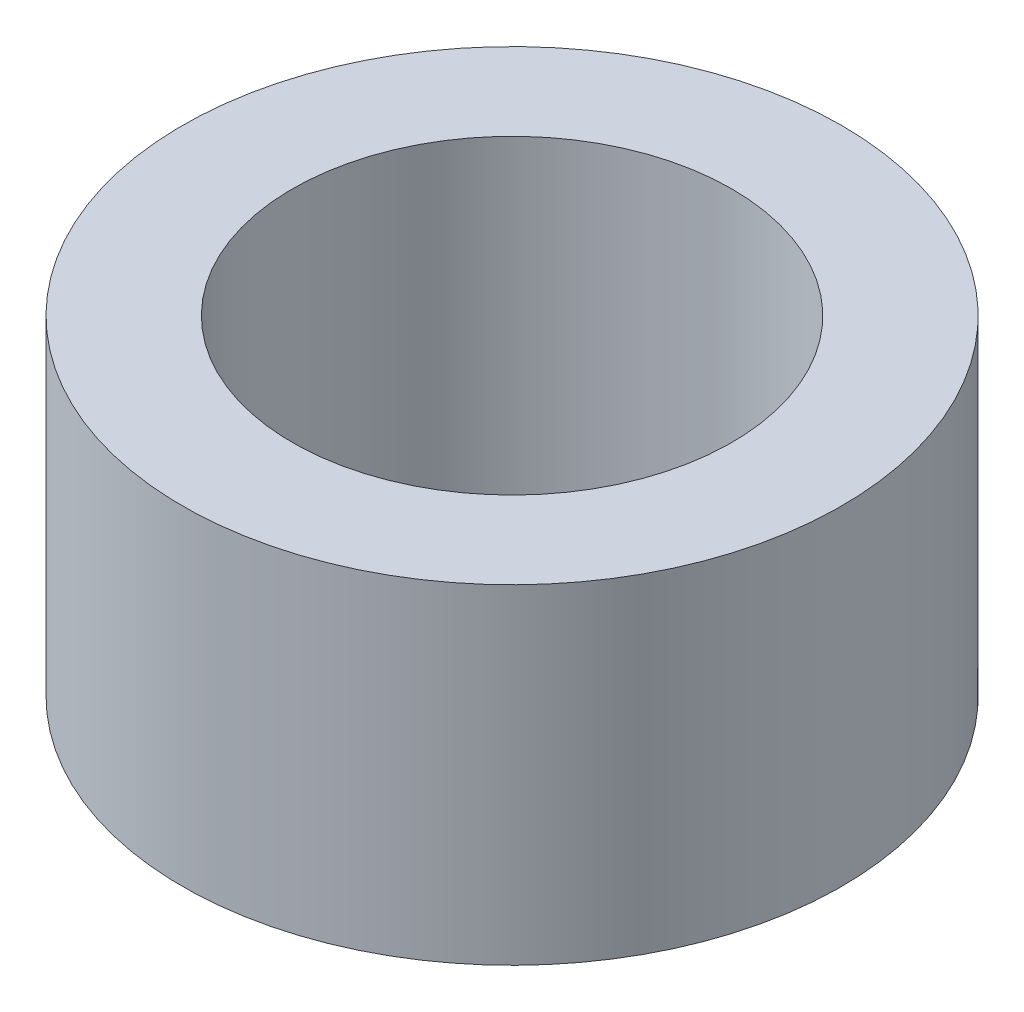
ISO-10303-21;
HEADER;
FILE_DESCRIPTION(('STEP AP214'),'2;1');
FILE_NAME('part.step','',(''),(''),'','','');
FILE_SCHEMA(('AUTOMOTIVE_DESIGN { 1 0 10303 214 1 1 1 1 }'));
ENDSEC;
DATA;
#1=APPLICATION_CONTEXT('core data for automotive mechanical design processes');
#2=APPLICATION_PROTOCOL_DEFINITION('international standard','automotive_design',2000,#1);
#3=PRODUCT_CONTEXT('',#1,'mechanical');
#4=PRODUCT('Part','Part','',(#3));
#5=PRODUCT_RELATED_PRODUCT_CATEGORY('part','',(#4));
#6=PRODUCT_DEFINITION_FORMATION('','',#4);
#7=PRODUCT_DEFINITION_CONTEXT('part definition',#1,'design');
#8=PRODUCT_DEFINITION('design','',#6,#7);
#9=PRODUCT_DEFINITION_SHAPE('','',#8);
#10=(LENGTH_UNIT() NAMED_UNIT(*) SI_UNIT(.MILLI.,.METRE.));
#11=(NAMED_UNIT(*) PLANE_ANGLE_UNIT() SI_UNIT($,.RADIAN.));
#12=(NAMED_UNIT(*) SI_UNIT($,.STERADIAN.) SOLID_ANGLE_UNIT());
#13=UNCERTAINTY_MEASURE_WITH_UNIT(LENGTH_MEASURE(1.E-05),#10,'distance_accuracy_value','');
#14=(GEOMETRIC_REPRESENTATION_CONTEXT(3) GLOBAL_UNCERTAINTY_ASSIGNED_CONTEXT((#13)) GLOBAL_UNIT_ASSIGNED_CONTEXT((#10,
#11,#12)) REPRESENTATION_CONTEXT('',''));
#15=CARTESIAN_POINT('',(0.,0.,0.));
#16=DIRECTION('',(0.,0.,1.));
#17=DIRECTION('',(1.,0.,0.));
#18=AXIS2_PLACEMENT_3D('',#15,#16,#17);
#19=CARTESIAN_POINT('',(0.,4.7625,0.));
#20=DIRECTION('',(0.,1.,0.));
#21=DIRECTION('',(0.,0.,1.));
#22=AXIS2_PLACEMENT_3D('',#19,#20,#21);
#23=PLANE('',#22);
#24=CARTESIAN_POINT('',(0.,4.7625,0.));
#25=DIRECTION('',(0.,1.,0.));
#26=DIRECTION('',(0.,0.,1.));
#27=AXIS2_PLACEMENT_3D('',#24,#25,#26);
#28=CIRCLE('',#27,9.525);
#29=CARTESIAN_POINT('',(0.,4.7625,-9.525));
#30=VERTEX_POINT('',#29);
#31=EDGE_CURVE('E10',#30,#30,#28,.T.);
#32=ORIENTED_EDGE('',*,*,#31,.T.);
#33=EDGE_LOOP('',(#32));
#34=FACE_BOUND('',#33,.T.);
#35=CARTESIAN_POINT('',(0.,4.7625,0.));
#36=DIRECTION('',(0.,1.,0.));
#37=DIRECTION('',(0.,0.,1.));
#38=AXIS2_PLACEMENT_3D('',#35,#36,#37);
#39=CIRCLE('',#38,6.35);
#40=CARTESIAN_POINT('',(0.,4.7625,-6.35));
#41=VERTEX_POINT('',#40);
#42=EDGE_CURVE('E43',#41,#41,#39,.T.);
#43=ORIENTED_EDGE('',*,*,#42,.F.);
#44=EDGE_LOOP('',(#43));
#45=FACE_BOUND('',#44,.T.);
#46=ADVANCED_FACE('F32',(#34,#45),#23,.T.);
#47=CARTESIAN_POINT('',(0.,-4.7625,0.));
#48=DIRECTION('',(0.,1.,0.));
#49=DIRECTION('',(0.,0.,1.));
#50=AXIS2_PLACEMENT_3D('',#47,#48,#49);
#51=PLANE('',#50);
#52=CARTESIAN_POINT('',(0.,-4.7625,0.));
#53=DIRECTION('',(0.,1.,0.));
#54=DIRECTION('',(0.,0.,1.));
#55=AXIS2_PLACEMENT_3D('',#52,#53,#54);
#56=CIRCLE('',#55,9.525);
#57=CARTESIAN_POINT('',(0.,-4.7625,-9.525));
#58=VERTEX_POINT('',#57);
#59=EDGE_CURVE('E36',#58,#58,#56,.T.);
#60=ORIENTED_EDGE('',*,*,#59,.F.);
#61=EDGE_LOOP('',(#60));
#62=FACE_BOUND('',#61,.T.);
#63=CARTESIAN_POINT('',(0.,-4.7625,0.));
#64=DIRECTION('',(0.,1.,0.));
#65=DIRECTION('',(0.,0.,1.));
#66=AXIS2_PLACEMENT_3D('',#63,#64,#65);
#67=CIRCLE('',#66,6.35);
#68=CARTESIAN_POINT('',(0.,-4.7625,-6.35));
#69=VERTEX_POINT('',#68);
#70=EDGE_CURVE('E45',#69,#69,#67,.T.);
#71=ORIENTED_EDGE('',*,*,#70,.T.);
#72=EDGE_LOOP('',(#71));
#73=FACE_BOUND('',#72,.T.);
#74=ADVANCED_FACE('F55',(#62,#73),#51,.F.);
#75=CARTESIAN_POINT('',(0.,4.7625,0.));
#76=DIRECTION('',(0.,-1.,0.));
#77=DIRECTION('',(0.,0.,-1.));
#78=AXIS2_PLACEMENT_3D('',#75,#76,#77);
#79=CYLINDRICAL_SURFACE('',#78,9.525);
#80=CARTESIAN_POINT('',(0.,4.7625,-9.525));
#81=CARTESIAN_POINT('',(0.,4.66328125,-9.525));
#82=CARTESIAN_POINT('',(0.,4.5640625,-9.525));
#83=CARTESIAN_POINT('',(0.,4.365625,-9.525));
#84=CARTESIAN_POINT('',(0.,4.26640625,-9.525));
#85=CARTESIAN_POINT('',(0.,4.06796875,-9.525));
#86=CARTESIAN_POINT('',(0.,3.96875,-9.525));
#87=CARTESIAN_POINT('',(0.,3.7703125,-9.525));
#88=CARTESIAN_POINT('',(0.,3.67109375,-9.525));
#89=CARTESIAN_POINT('',(0.,3.47265625,-9.525));
#90=CARTESIAN_POINT('',(0.,3.3734375,-9.525));
#91=CARTESIAN_POINT('',(0.,3.175,-9.525));
#92=CARTESIAN_POINT('',(0.,3.07578125,-9.525));
#93=CARTESIAN_POINT('',(0.,2.87734375,-9.525));
#94=CARTESIAN_POINT('',(0.,2.778125,-9.525));
#95=CARTESIAN_POINT('',(0.,2.5796875,-9.525));
#96=CARTESIAN_POINT('',(0.,2.48046875,-9.525));
#97=CARTESIAN_POINT('',(0.,2.28203125,-9.525));
#98=CARTESIAN_POINT('',(0.,2.1828125,-9.525));
#99=CARTESIAN_POINT('',(0.,1.984375,-9.525));
#100=CARTESIAN_POINT('',(0.,1.88515625,-9.525));
#101=CARTESIAN_POINT('',(0.,1.68671875,-9.525));
#102=CARTESIAN_POINT('',(0.,1.5875,-9.525));
#103=CARTESIAN_POINT('',(0.,1.3890625,-9.525));
#104=CARTESIAN_POINT('',(0.,1.28984375,-9.525));
#105=CARTESIAN_POINT('',(0.,1.09140625,-9.525));
#106=CARTESIAN_POINT('',(0.,0.992187499999999,-9.525));
#107=CARTESIAN_POINT('',(0.,0.79375,-9.525));
#108=CARTESIAN_POINT('',(0.,0.69453125,-9.525));
#109=CARTESIAN_POINT('',(0.,0.49609375,-9.525));
#110=CARTESIAN_POINT('',(0.,0.396875,-9.525));
#111=CARTESIAN_POINT('',(0.,0.1984375,-9.525));
#112=CARTESIAN_POINT('',(0.,0.0992187500000001,-9.525));
#113=CARTESIAN_POINT('',(0.,-0.0992187500000001,-9.525));
#114=CARTESIAN_POINT('',(0.,-0.1984375,-9.525));
#115=CARTESIAN_POINT('',(0.,-0.396875,-9.525));
#116=CARTESIAN_POINT('',(0.,-0.49609375,-9.525));
#117=CARTESIAN_POINT('',(0.,-0.69453125,-9.525));
#118=CARTESIAN_POINT('',(0.,-0.793750000000001,-9.525));
#119=CARTESIAN_POINT('',(0.,-0.992187500000001,-9.525));
#120=CARTESIAN_POINT('',(0.,-1.09140625,-9.525));
#121=CARTESIAN_POINT('',(0.,-1.28984375,-9.525));
#122=CARTESIAN_POINT('',(0.,-1.3890625,-9.525));
#123=CARTESIAN_POINT('',(0.,-1.5875,-9.525));
#124=CARTESIAN_POINT('',(0.,-1.68671875,-9.525));
#125=CARTESIAN_POINT('',(0.,-1.88515625,-9.525));
#126=CARTESIAN_POINT('',(0.,-1.984375,-9.525));
#127=CARTESIAN_POINT('',(0.,-2.1828125,-9.525));
#128=CARTESIAN_POINT('',(0.,-2.28203125,-9.525));
#129=CARTESIAN_POINT('',(0.,-2.48046875,-9.525));
#130=CARTESIAN_POINT('',(0.,-2.5796875,-9.525));
#131=CARTESIAN_POINT('',(0.,-2.778125,-9.525));
#132=CARTESIAN_POINT('',(0.,-2.87734375,-9.525));
#133=CARTESIAN_POINT('',(0.,-3.07578125,-9.525));
#134=CARTESIAN_POINT('',(0.,-3.175,-9.525));
#135=CARTESIAN_POINT('',(0.,-3.3734375,-9.525));
#136=CARTESIAN_POINT('',(0.,-3.47265625,-9.525));
#137=CARTESIAN_POINT('',(0.,-3.67109375,-9.525));
#138=CARTESIAN_POINT('',(0.,-3.7703125,-9.525));
#139=CARTESIAN_POINT('',(0.,-3.96875,-9.525));
#140=CARTESIAN_POINT('',(0.,-4.06796875,-9.525));
#141=CARTESIAN_POINT('',(0.,-4.26640625,-9.525));
#142=CARTESIAN_POINT('',(0.,-4.365625,-9.525));
#143=CARTESIAN_POINT('',(0.,-4.5640625,-9.525));
#144=CARTESIAN_POINT('',(0.,-4.66328125,-9.525));
#145=CARTESIAN_POINT('',(0.,-4.7625,-9.525));
#146=B_SPLINE_CURVE_WITH_KNOTS('',3,(#80,#81,#82,#83,#84,#85,#86,#87,#88,#89,#90,#91,#92,#93,
#94,#95,#96,#97,#98,#99,#100,#101,#102,#103,#104,#105,#106,#107,#108,#109,#110,#111,#112,#113,
#114,#115,#116,#117,#118,#119,#120,#121,#122,#123,#124,#125,#126,#127,#128,#129,#130,#131,#132,
#133,#134,#135,#136,#137,#138,#139,#140,#141,#142,#143,#144,#145),.UNSPECIFIED.,.F.,.F.,(4,2,2,
2,2,2,2,2,2,2,2,2,2,2,2,2,2,2,2,2,2,2,2,2,2,2,2,2,2,2,2,2,4),(0.,0.29765625,0.5953125,
0.892968750000001,1.190625,1.48828125,1.7859375,2.08359375,2.38125,2.67890625,2.9765625,
3.27421875,3.571875,3.86953125,4.1671875,4.46484375,4.7625,5.06015625,5.3578125,5.65546875,
5.953125,6.25078125,6.5484375,6.84609375,7.14375,7.44140625,7.7390625,8.03671875,8.334375,
8.63203125,8.9296875,9.22734375,9.525),.UNSPECIFIED.);
#147=EDGE_CURVE('BSEAM34',#30,#58,#146,.T.);
#148=ORIENTED_EDGE('',*,*,#31,.F.);
#149=ORIENTED_EDGE('',*,*,#59,.T.);
#150=ORIENTED_EDGE('',*,*,#147,.T.);
#151=ORIENTED_EDGE('',*,*,#147,.F.);
#152=EDGE_LOOP('',(#148,#150,#149,#151));
#153=FACE_BOUND('',#152,.T.);
#154=ADVANCED_FACE('F34',(#153),#79,.T.);
#155=CARTESIAN_POINT('',(0.,4.7625,0.));
#156=DIRECTION('',(0.,-1.,0.));
#157=DIRECTION('',(0.,0.,-1.));
#158=AXIS2_PLACEMENT_3D('',#155,#156,#157);
#159=CYLINDRICAL_SURFACE('',#158,6.35);
#160=CARTESIAN_POINT('',(0.,4.7625,-6.35));
#161=CARTESIAN_POINT('',(0.,4.66328125,-6.35));
#162=CARTESIAN_POINT('',(0.,4.5640625,-6.35));
#163=CARTESIAN_POINT('',(0.,4.365625,-6.35));
#164=CARTESIAN_POINT('',(0.,4.26640625,-6.35));
#165=CARTESIAN_POINT('',(0.,4.06796875,-6.35));
#166=CARTESIAN_POINT('',(0.,3.96875,-6.35));
#167=CARTESIAN_POINT('',(0.,3.7703125,-6.35));
#168=CARTESIAN_POINT('',(0.,3.67109375,-6.35));
#169=CARTESIAN_POINT('',(0.,3.47265625,-6.35));
#170=CARTESIAN_POINT('',(0.,3.3734375,-6.35));
#171=CARTESIAN_POINT('',(0.,3.175,-6.35));
#172=CARTESIAN_POINT('',(0.,3.07578125,-6.35));
#173=CARTESIAN_POINT('',(0.,2.87734375,-6.35));
#174=CARTESIAN_POINT('',(0.,2.778125,-6.35));
#175=CARTESIAN_POINT('',(0.,2.5796875,-6.35));
#176=CARTESIAN_POINT('',(0.,2.48046875,-6.35));
#177=CARTESIAN_POINT('',(0.,2.28203125,-6.35));
#178=CARTESIAN_POINT('',(0.,2.1828125,-6.35));
#179=CARTESIAN_POINT('',(0.,1.984375,-6.35));
#180=CARTESIAN_POINT('',(0.,1.88515625,-6.35));
#181=CARTESIAN_POINT('',(0.,1.68671875,-6.35));
#182=CARTESIAN_POINT('',(0.,1.5875,-6.35));
#183=CARTESIAN_POINT('',(0.,1.3890625,-6.35));
#184=CARTESIAN_POINT('',(0.,1.28984375,-6.35));
#185=CARTESIAN_POINT('',(0.,1.09140625,-6.35));
#186=CARTESIAN_POINT('',(0.,0.992187499999999,-6.35));
#187=CARTESIAN_POINT('',(0.,0.793749999999999,-6.35));
#188=CARTESIAN_POINT('',(0.,0.694531249999999,-6.35));
#189=CARTESIAN_POINT('',(0.,0.496093749999999,-6.35));
#190=CARTESIAN_POINT('',(0.,0.396874999999999,-6.35));
#191=CARTESIAN_POINT('',(0.,0.198437499999999,-6.35));
#192=CARTESIAN_POINT('',(0.,0.0992187499999992,-6.35));
#193=CARTESIAN_POINT('',(0.,-0.0992187500000009,-6.35));
#194=CARTESIAN_POINT('',(0.,-0.198437500000001,-6.35));
#195=CARTESIAN_POINT('',(0.,-0.396875000000001,-6.35));
#196=CARTESIAN_POINT('',(0.,-0.496093750000001,-6.35));
#197=CARTESIAN_POINT('',(0.,-0.694531250000001,-6.35));
#198=CARTESIAN_POINT('',(0.,-0.793750000000001,-6.35));
#199=CARTESIAN_POINT('',(0.,-0.992187500000002,-6.35));
#200=CARTESIAN_POINT('',(0.,-1.09140625,-6.35));
#201=CARTESIAN_POINT('',(0.,-1.28984375,-6.35));
#202=CARTESIAN_POINT('',(0.,-1.3890625,-6.35));
#203=CARTESIAN_POINT('',(0.,-1.5875,-6.35));
#204=CARTESIAN_POINT('',(0.,-1.68671875,-6.35));
#205=CARTESIAN_POINT('',(0.,-1.88515625,-6.35));
#206=CARTESIAN_POINT('',(0.,-1.984375,-6.35));
#207=CARTESIAN_POINT('',(0.,-2.1828125,-6.35));
#208=CARTESIAN_POINT('',(0.,-2.28203125,-6.35));
#209=CARTESIAN_POINT('',(0.,-2.48046875,-6.35));
#210=CARTESIAN_POINT('',(0.,-2.5796875,-6.35));
#211=CARTESIAN_POINT('',(0.,-2.778125,-6.35));
#212=CARTESIAN_POINT('',(0.,-2.87734375,-6.35));
#213=CARTESIAN_POINT('',(0.,-3.07578125,-6.35));
#214=CARTESIAN_POINT('',(0.,-3.175,-6.35));
#215=CARTESIAN_POINT('',(0.,-3.3734375,-6.35));
#216=CARTESIAN_POINT('',(0.,-3.47265625,-6.35));
#217=CARTESIAN_POINT('',(0.,-3.67109375,-6.35));
#218=CARTESIAN_POINT('',(0.,-3.7703125,-6.35));
#219=CARTESIAN_POINT('',(0.,-3.96875,-6.35));
#220=CARTESIAN_POINT('',(0.,-4.06796875,-6.35));
#221=CARTESIAN_POINT('',(0.,-4.26640625,-6.35));
#222=CARTESIAN_POINT('',(0.,-4.365625,-6.35));
#223=CARTESIAN_POINT('',(0.,-4.5640625,-6.35));
#224=CARTESIAN_POINT('',(0.,-4.66328125,-6.35));
#225=CARTESIAN_POINT('',(0.,-4.7625,-6.35));
#226=B_SPLINE_CURVE_WITH_KNOTS('',3,(#160,#161,#162,#163,#164,#165,#166,#167,#168,#169,#170,
#171,#172,#173,#174,#175,#176,#177,#178,#179,#180,#181,#182,#183,#184,#185,#186,#187,#188,#189,
#190,#191,#192,#193,#194,#195,#196,#197,#198,#199,#200,#201,#202,#203,#204,#205,#206,#207,#208,
#209,#210,#211,#212,#213,#214,#215,#216,#217,#218,#219,#220,#221,#222,#223,#224,#225),
.UNSPECIFIED.,.F.,.F.,(4,2,2,2,2,2,2,2,2,2,2,2,2,2,2,2,2,2,2,2,2,2,2,2,2,2,2,2,2,2,2,2,4),(0.,
0.297656249999999,0.595312499999999,0.89296875,1.190625,1.48828125,1.7859375,2.08359375,2.38125,
2.67890625,2.9765625,3.27421875,3.571875,3.86953125,4.1671875,4.46484375,4.7625,5.06015625,
5.3578125,5.65546875,5.953125,6.25078125,6.5484375,6.84609375,7.14375,7.44140625,7.7390625,
8.03671875,8.334375,8.63203125,8.9296875,9.22734375,9.525),.UNSPECIFIED.);
#227=EDGE_CURVE('BSEAM51',#41,#69,#226,.T.);
#228=ORIENTED_EDGE('',*,*,#42,.T.);
#229=ORIENTED_EDGE('',*,*,#70,.F.);
#230=ORIENTED_EDGE('',*,*,#227,.T.);
#231=ORIENTED_EDGE('',*,*,#227,.F.);
#232=EDGE_LOOP('',(#228,#230,#229,#231));
#233=FACE_BOUND('',#232,.T.);
#234=ADVANCED_FACE('F51',(#233),#159,.F.);
#235=CLOSED_SHELL('',(#46,#74,#154,#234));
#236=MANIFOLD_SOLID_BREP('B2',#235);
#237=ADVANCED_BREP_SHAPE_REPRESENTATION('',(#18,#236),#14);
#238=SHAPE_DEFINITION_REPRESENTATION(#9,#237);
ENDSEC;
END-ISO-10303-21;
